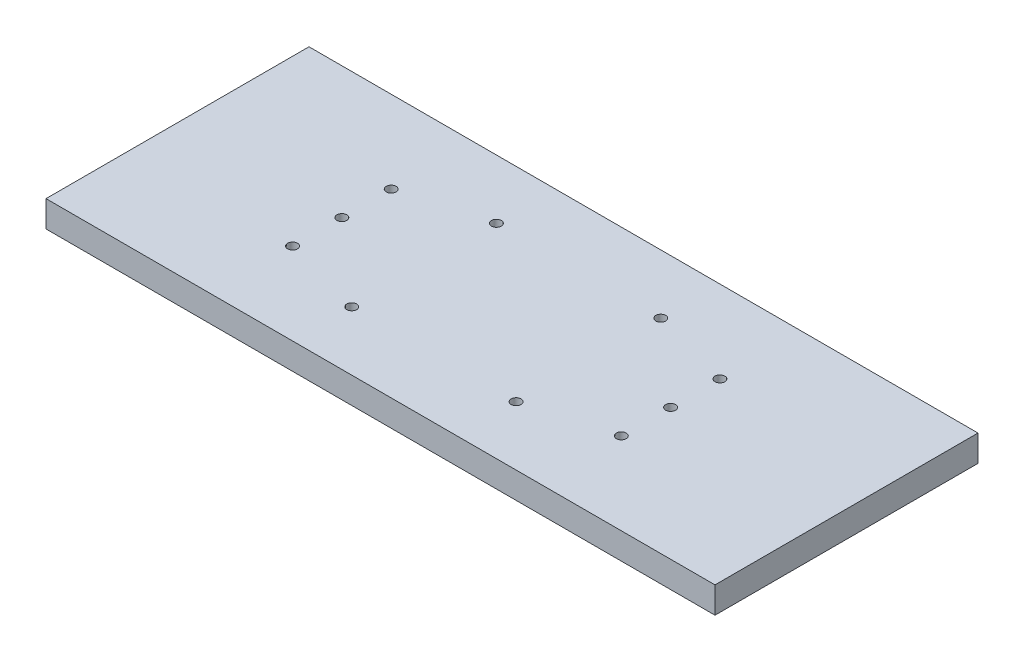
ISO-10303-21;
HEADER;
FILE_DESCRIPTION(('STEP AP214'),'2;1');
FILE_NAME('part.step','',(''),(''),'','','');
FILE_SCHEMA(('AUTOMOTIVE_DESIGN { 1 0 10303 214 1 1 1 1 }'));
ENDSEC;
DATA;
#1=APPLICATION_CONTEXT('core data for automotive mechanical design processes');
#2=APPLICATION_PROTOCOL_DEFINITION('international standard','automotive_design',2000,#1);
#3=PRODUCT_CONTEXT('',#1,'mechanical');
#4=PRODUCT('Part','Part','',(#3));
#5=PRODUCT_RELATED_PRODUCT_CATEGORY('part','',(#4));
#6=PRODUCT_DEFINITION_FORMATION('','',#4);
#7=PRODUCT_DEFINITION_CONTEXT('part definition',#1,'design');
#8=PRODUCT_DEFINITION('design','',#6,#7);
#9=PRODUCT_DEFINITION_SHAPE('','',#8);
#10=(LENGTH_UNIT() NAMED_UNIT(*) SI_UNIT(.MILLI.,.METRE.));
#11=(NAMED_UNIT(*) PLANE_ANGLE_UNIT() SI_UNIT($,.RADIAN.));
#12=(NAMED_UNIT(*) SI_UNIT($,.STERADIAN.) SOLID_ANGLE_UNIT());
#13=UNCERTAINTY_MEASURE_WITH_UNIT(LENGTH_MEASURE(1.E-05),#10,'distance_accuracy_value','');
#14=(GEOMETRIC_REPRESENTATION_CONTEXT(3) GLOBAL_UNCERTAINTY_ASSIGNED_CONTEXT((#13)) GLOBAL_UNIT_ASSIGNED_CONTEXT((#10,
#11,#12)) REPRESENTATION_CONTEXT('',''));
#15=CARTESIAN_POINT('',(0.,0.,0.));
#16=DIRECTION('',(0.,0.,1.));
#17=DIRECTION('',(1.,0.,0.));
#18=AXIS2_PLACEMENT_3D('',#15,#16,#17);
#19=CARTESIAN_POINT('',(203.5,16.,-80.));
#20=DIRECTION('',(-1.,0.,0.));
#21=DIRECTION('',(0.,0.,1.));
#22=AXIS2_PLACEMENT_3D('',#19,#20,#21);
#23=PLANE('',#22);
#24=DIRECTION('',(0.,0.,-1.));
#25=VECTOR('',#24,1.);
#26=CARTESIAN_POINT('',(203.5,0.,-80.));
#27=LINE('',#26,#25);
#28=CARTESIAN_POINT('',(203.5,0.,80.));
#29=VERTEX_POINT('',#28);
#30=CARTESIAN_POINT('',(203.5,0.,-80.));
#31=VERTEX_POINT('',#30);
#32=EDGE_CURVE('E96',#29,#31,#27,.T.);
#33=ORIENTED_EDGE('',*,*,#32,.T.);
#34=DIRECTION('',(0.,-1.,0.));
#35=VECTOR('',#34,1.);
#36=CARTESIAN_POINT('',(203.5,16.,-80.));
#37=LINE('',#36,#35);
#38=CARTESIAN_POINT('',(203.5,16.,-80.));
#39=VERTEX_POINT('',#38);
#40=EDGE_CURVE('E11',#39,#31,#37,.T.);
#41=ORIENTED_EDGE('',*,*,#40,.F.);
#42=DIRECTION('',(0.,0.,-1.));
#43=VECTOR('',#42,1.);
#44=CARTESIAN_POINT('',(203.5,16.,-80.));
#45=LINE('',#44,#43);
#46=CARTESIAN_POINT('',(203.5,16.,80.));
#47=VERTEX_POINT('',#46);
#48=EDGE_CURVE('E84',#47,#39,#45,.T.);
#49=ORIENTED_EDGE('',*,*,#48,.F.);
#50=DIRECTION('',(0.,-1.,0.));
#51=VECTOR('',#50,1.);
#52=CARTESIAN_POINT('',(203.5,16.,80.));
#53=LINE('',#52,#51);
#54=EDGE_CURVE('E92',#47,#29,#53,.T.);
#55=ORIENTED_EDGE('',*,*,#54,.T.);
#56=EDGE_LOOP('',(#33,#41,#49,#55));
#57=FACE_BOUND('',#56,.T.);
#58=ADVANCED_FACE('F33',(#57),#23,.F.);
#59=CARTESIAN_POINT('',(-203.5,16.,-80.));
#60=DIRECTION('',(0.,0.,1.));
#61=DIRECTION('',(1.,0.,0.));
#62=AXIS2_PLACEMENT_3D('',#59,#60,#61);
#63=PLANE('',#62);
#64=DIRECTION('',(-1.,0.,0.));
#65=VECTOR('',#64,1.);
#66=CARTESIAN_POINT('',(-203.5,0.,-80.));
#67=LINE('',#66,#65);
#68=CARTESIAN_POINT('',(-203.5,0.,-80.));
#69=VERTEX_POINT('',#68);
#70=EDGE_CURVE('E88',#31,#69,#67,.T.);
#71=ORIENTED_EDGE('',*,*,#70,.T.);
#72=DIRECTION('',(0.,-1.,0.));
#73=VECTOR('',#72,1.);
#74=CARTESIAN_POINT('',(-203.5,16.,-80.));
#75=LINE('',#74,#73);
#76=CARTESIAN_POINT('',(-203.5,16.,-80.));
#77=VERTEX_POINT('',#76);
#78=EDGE_CURVE('E41',#77,#69,#75,.T.);
#79=ORIENTED_EDGE('',*,*,#78,.F.);
#80=DIRECTION('',(-1.,0.,0.));
#81=VECTOR('',#80,1.);
#82=CARTESIAN_POINT('',(-203.5,16.,-80.));
#83=LINE('',#82,#81);
#84=EDGE_CURVE('E79',#39,#77,#83,.T.);
#85=ORIENTED_EDGE('',*,*,#84,.F.);
#86=ORIENTED_EDGE('',*,*,#40,.T.);
#87=EDGE_LOOP('',(#71,#79,#85,#86));
#88=FACE_BOUND('',#87,.T.);
#89=ADVANCED_FACE('F87',(#88),#63,.F.);
#90=CARTESIAN_POINT('',(-203.5,16.,-80.));
#91=DIRECTION('',(1.,0.,0.));
#92=DIRECTION('',(0.,0.,-1.));
#93=AXIS2_PLACEMENT_3D('',#90,#91,#92);
#94=PLANE('',#93);
#95=DIRECTION('',(0.,0.,1.));
#96=VECTOR('',#95,1.);
#97=CARTESIAN_POINT('',(-203.5,0.,-80.));
#98=LINE('',#97,#96);
#99=CARTESIAN_POINT('',(-203.5,0.,80.));
#100=VERTEX_POINT('',#99);
#101=EDGE_CURVE('E66',#69,#100,#98,.T.);
#102=ORIENTED_EDGE('',*,*,#101,.T.);
#103=DIRECTION('',(0.,-1.,0.));
#104=VECTOR('',#103,1.);
#105=CARTESIAN_POINT('',(-203.5,16.,80.));
#106=LINE('',#105,#104);
#107=CARTESIAN_POINT('',(-203.5,16.,80.));
#108=VERTEX_POINT('',#107);
#109=EDGE_CURVE('E89',#108,#100,#106,.T.);
#110=ORIENTED_EDGE('',*,*,#109,.F.);
#111=DIRECTION('',(0.,0.,1.));
#112=VECTOR('',#111,1.);
#113=CARTESIAN_POINT('',(-203.5,16.,-80.));
#114=LINE('',#113,#112);
#115=EDGE_CURVE('E82',#77,#108,#114,.T.);
#116=ORIENTED_EDGE('',*,*,#115,.F.);
#117=ORIENTED_EDGE('',*,*,#78,.T.);
#118=EDGE_LOOP('',(#102,#110,#116,#117));
#119=FACE_BOUND('',#118,.T.);
#120=ADVANCED_FACE('F90',(#119),#94,.F.);
#121=CARTESIAN_POINT('',(-203.5,16.,80.));
#122=DIRECTION('',(0.,0.,-1.));
#123=DIRECTION('',(-1.,0.,0.));
#124=AXIS2_PLACEMENT_3D('',#121,#122,#123);
#125=PLANE('',#124);
#126=DIRECTION('',(1.,0.,0.));
#127=VECTOR('',#126,1.);
#128=CARTESIAN_POINT('',(-203.5,0.,80.));
#129=LINE('',#128,#127);
#130=EDGE_CURVE('E72',#100,#29,#129,.T.);
#131=ORIENTED_EDGE('',*,*,#130,.T.);
#132=ORIENTED_EDGE('',*,*,#54,.F.);
#133=DIRECTION('',(1.,0.,0.));
#134=VECTOR('',#133,1.);
#135=CARTESIAN_POINT('',(-203.5,16.,80.));
#136=LINE('',#135,#134);
#137=EDGE_CURVE('E49',#108,#47,#136,.T.);
#138=ORIENTED_EDGE('',*,*,#137,.F.);
#139=ORIENTED_EDGE('',*,*,#109,.T.);
#140=EDGE_LOOP('',(#131,#132,#138,#139));
#141=FACE_BOUND('',#140,.T.);
#142=ADVANCED_FACE('F104',(#141),#125,.F.);
#143=CARTESIAN_POINT('',(0.,16.,0.));
#144=DIRECTION('',(0.,1.,0.));
#145=DIRECTION('',(0.,0.,1.));
#146=AXIS2_PLACEMENT_3D('',#143,#144,#145);
#147=PLANE('',#146);
#148=CARTESIAN_POINT('',(-103.5,16.,30.));
#149=DIRECTION('',(0.,1.,0.));
#150=DIRECTION('',(0.,0.,1.));
#151=AXIS2_PLACEMENT_3D('',#148,#149,#150);
#152=CIRCLE('',#151,3.00000000000004);
#153=CARTESIAN_POINT('',(-103.5,16.,33.));
#154=VERTEX_POINT('',#153);
#155=EDGE_CURVE('E164',#154,#154,#152,.T.);
#156=ORIENTED_EDGE('',*,*,#155,.F.);
#157=EDGE_LOOP('',(#156));
#158=FACE_BOUND('',#157,.T.);
#159=CARTESIAN_POINT('',(-103.5,16.,0.));
#160=DIRECTION('',(0.,1.,0.));
#161=DIRECTION('',(0.,0.,-1.));
#162=AXIS2_PLACEMENT_3D('',#159,#160,#161);
#163=CIRCLE('',#162,2.99999999999999);
#164=CARTESIAN_POINT('',(-103.5,16.,-2.99999999999997));
#165=VERTEX_POINT('',#164);
#166=EDGE_CURVE('E158',#165,#165,#163,.T.);
#167=ORIENTED_EDGE('',*,*,#166,.F.);
#168=EDGE_LOOP('',(#167));
#169=FACE_BOUND('',#168,.T.);
#170=CARTESIAN_POINT('',(-103.5,16.,-30.));
#171=DIRECTION('',(0.,1.,0.));
#172=DIRECTION('',(0.,0.,-1.));
#173=AXIS2_PLACEMENT_3D('',#170,#171,#172);
#174=CIRCLE('',#173,3.00000000000004);
#175=CARTESIAN_POINT('',(-103.5,16.,-33.));
#176=VERTEX_POINT('',#175);
#177=EDGE_CURVE('E152',#176,#176,#174,.T.);
#178=ORIENTED_EDGE('',*,*,#177,.F.);
#179=EDGE_LOOP('',(#178));
#180=FACE_BOUND('',#179,.T.);
#181=CARTESIAN_POINT('',(96.4999999999999,16.,30.));
#182=DIRECTION('',(0.,1.,0.));
#183=DIRECTION('',(0.,0.,-1.));
#184=AXIS2_PLACEMENT_3D('',#181,#182,#183);
#185=CIRCLE('',#184,3.00000000000001);
#186=CARTESIAN_POINT('',(96.4999999999999,16.,27.));
#187=VERTEX_POINT('',#186);
#188=EDGE_CURVE('E146',#187,#187,#185,.T.);
#189=ORIENTED_EDGE('',*,*,#188,.F.);
#190=EDGE_LOOP('',(#189));
#191=FACE_BOUND('',#190,.T.);
#192=CARTESIAN_POINT('',(96.4999999999999,16.,-30.));
#193=DIRECTION('',(0.,1.,0.));
#194=DIRECTION('',(0.,0.,1.));
#195=AXIS2_PLACEMENT_3D('',#192,#193,#194);
#196=CIRCLE('',#195,3.00000000000001);
#197=CARTESIAN_POINT('',(96.4999999999999,16.,-27.));
#198=VERTEX_POINT('',#197);
#199=EDGE_CURVE('E140',#198,#198,#196,.T.);
#200=ORIENTED_EDGE('',*,*,#199,.F.);
#201=EDGE_LOOP('',(#200));
#202=FACE_BOUND('',#201,.T.);
#203=CARTESIAN_POINT('',(96.5,16.,0.));
#204=DIRECTION('',(0.,1.,0.));
#205=DIRECTION('',(0.,0.,1.));
#206=AXIS2_PLACEMENT_3D('',#203,#204,#205);
#207=CIRCLE('',#206,3.00000000000001);
#208=CARTESIAN_POINT('',(96.5,16.,3.00000000000001));
#209=VERTEX_POINT('',#208);
#210=EDGE_CURVE('E134',#209,#209,#207,.T.);
#211=ORIENTED_EDGE('',*,*,#210,.F.);
#212=EDGE_LOOP('',(#211));
#213=FACE_BOUND('',#212,.T.);
#214=CARTESIAN_POINT('',(-53.5,16.,44.));
#215=DIRECTION('',(0.,1.,0.));
#216=DIRECTION('',(0.,0.,-1.));
#217=AXIS2_PLACEMENT_3D('',#214,#215,#216);
#218=CIRCLE('',#217,2.99999999999999);
#219=CARTESIAN_POINT('',(-53.5,16.,41.));
#220=VERTEX_POINT('',#219);
#221=EDGE_CURVE('E128',#220,#220,#218,.T.);
#222=ORIENTED_EDGE('',*,*,#221,.F.);
#223=EDGE_LOOP('',(#222));
#224=FACE_BOUND('',#223,.T.);
#225=CARTESIAN_POINT('',(46.5,16.,44.));
#226=DIRECTION('',(0.,1.,0.));
#227=DIRECTION('',(0.,0.,-1.));
#228=AXIS2_PLACEMENT_3D('',#225,#226,#227);
#229=CIRCLE('',#228,3.00000000000001);
#230=CARTESIAN_POINT('',(46.5,16.,41.));
#231=VERTEX_POINT('',#230);
#232=EDGE_CURVE('E122',#231,#231,#229,.T.);
#233=ORIENTED_EDGE('',*,*,#232,.F.);
#234=EDGE_LOOP('',(#233));
#235=FACE_BOUND('',#234,.T.);
#236=CARTESIAN_POINT('',(46.5,16.,-44.));
#237=DIRECTION('',(0.,1.,0.));
#238=DIRECTION('',(0.,0.,1.));
#239=AXIS2_PLACEMENT_3D('',#236,#237,#238);
#240=CIRCLE('',#239,3.00000000000001);
#241=CARTESIAN_POINT('',(46.5,16.,-41.));
#242=VERTEX_POINT('',#241);
#243=EDGE_CURVE('E116',#242,#242,#240,.T.);
#244=ORIENTED_EDGE('',*,*,#243,.F.);
#245=EDGE_LOOP('',(#244));
#246=FACE_BOUND('',#245,.T.);
#247=CARTESIAN_POINT('',(-53.5,16.,-44.));
#248=DIRECTION('',(0.,1.,0.));
#249=DIRECTION('',(0.,0.,1.));
#250=AXIS2_PLACEMENT_3D('',#247,#248,#249);
#251=CIRCLE('',#250,2.99999999999999);
#252=CARTESIAN_POINT('',(-53.5,16.,-41.));
#253=VERTEX_POINT('',#252);
#254=EDGE_CURVE('E110',#253,#253,#251,.T.);
#255=ORIENTED_EDGE('',*,*,#254,.F.);
#256=EDGE_LOOP('',(#255));
#257=FACE_BOUND('',#256,.T.);
#258=ORIENTED_EDGE('',*,*,#48,.T.);
#259=ORIENTED_EDGE('',*,*,#84,.T.);
#260=ORIENTED_EDGE('',*,*,#115,.T.);
#261=ORIENTED_EDGE('',*,*,#137,.T.);
#262=EDGE_LOOP('',(#258,#259,#260,#261));
#263=FACE_BOUND('',#262,.T.);
#264=ADVANCED_FACE('F80',(#158,#169,#180,#191,#202,#213,#224,#235,#246,#257,#263),#147,.T.);
#265=CARTESIAN_POINT('',(0.,0.,0.));
#266=DIRECTION('',(0.,1.,0.));
#267=DIRECTION('',(0.,0.,1.));
#268=AXIS2_PLACEMENT_3D('',#265,#266,#267);
#269=PLANE('',#268);
#270=CARTESIAN_POINT('',(-103.5,0.,30.));
#271=DIRECTION('',(0.,1.,0.));
#272=DIRECTION('',(0.,0.,1.));
#273=AXIS2_PLACEMENT_3D('',#270,#271,#272);
#274=CIRCLE('',#273,3.00000000000004);
#275=CARTESIAN_POINT('',(-103.5,0.,33.));
#276=VERTEX_POINT('',#275);
#277=EDGE_CURVE('E161',#276,#276,#274,.T.);
#278=ORIENTED_EDGE('',*,*,#277,.T.);
#279=EDGE_LOOP('',(#278));
#280=FACE_BOUND('',#279,.T.);
#281=CARTESIAN_POINT('',(-103.5,0.,0.));
#282=DIRECTION('',(0.,1.,0.));
#283=DIRECTION('',(0.,0.,-1.));
#284=AXIS2_PLACEMENT_3D('',#281,#282,#283);
#285=CIRCLE('',#284,2.99999999999999);
#286=CARTESIAN_POINT('',(-103.5,0.,-2.99999999999997));
#287=VERTEX_POINT('',#286);
#288=EDGE_CURVE('E155',#287,#287,#285,.T.);
#289=ORIENTED_EDGE('',*,*,#288,.T.);
#290=EDGE_LOOP('',(#289));
#291=FACE_BOUND('',#290,.T.);
#292=CARTESIAN_POINT('',(-103.5,0.,-30.));
#293=DIRECTION('',(0.,1.,0.));
#294=DIRECTION('',(0.,0.,-1.));
#295=AXIS2_PLACEMENT_3D('',#292,#293,#294);
#296=CIRCLE('',#295,3.00000000000004);
#297=CARTESIAN_POINT('',(-103.5,0.,-33.));
#298=VERTEX_POINT('',#297);
#299=EDGE_CURVE('E149',#298,#298,#296,.T.);
#300=ORIENTED_EDGE('',*,*,#299,.T.);
#301=EDGE_LOOP('',(#300));
#302=FACE_BOUND('',#301,.T.);
#303=CARTESIAN_POINT('',(96.4999999999999,0.,30.));
#304=DIRECTION('',(0.,1.,0.));
#305=DIRECTION('',(0.,0.,-1.));
#306=AXIS2_PLACEMENT_3D('',#303,#304,#305);
#307=CIRCLE('',#306,3.00000000000001);
#308=CARTESIAN_POINT('',(96.4999999999999,0.,27.));
#309=VERTEX_POINT('',#308);
#310=EDGE_CURVE('E143',#309,#309,#307,.T.);
#311=ORIENTED_EDGE('',*,*,#310,.T.);
#312=EDGE_LOOP('',(#311));
#313=FACE_BOUND('',#312,.T.);
#314=CARTESIAN_POINT('',(96.4999999999999,0.,-30.));
#315=DIRECTION('',(0.,1.,0.));
#316=DIRECTION('',(0.,0.,1.));
#317=AXIS2_PLACEMENT_3D('',#314,#315,#316);
#318=CIRCLE('',#317,3.00000000000001);
#319=CARTESIAN_POINT('',(96.4999999999999,0.,-27.));
#320=VERTEX_POINT('',#319);
#321=EDGE_CURVE('E137',#320,#320,#318,.T.);
#322=ORIENTED_EDGE('',*,*,#321,.T.);
#323=EDGE_LOOP('',(#322));
#324=FACE_BOUND('',#323,.T.);
#325=CARTESIAN_POINT('',(96.5,0.,0.));
#326=DIRECTION('',(0.,1.,0.));
#327=DIRECTION('',(0.,0.,1.));
#328=AXIS2_PLACEMENT_3D('',#325,#326,#327);
#329=CIRCLE('',#328,3.00000000000001);
#330=CARTESIAN_POINT('',(96.5,0.,3.00000000000001));
#331=VERTEX_POINT('',#330);
#332=EDGE_CURVE('E131',#331,#331,#329,.T.);
#333=ORIENTED_EDGE('',*,*,#332,.T.);
#334=EDGE_LOOP('',(#333));
#335=FACE_BOUND('',#334,.T.);
#336=CARTESIAN_POINT('',(-53.5,0.,44.));
#337=DIRECTION('',(0.,1.,0.));
#338=DIRECTION('',(0.,0.,-1.));
#339=AXIS2_PLACEMENT_3D('',#336,#337,#338);
#340=CIRCLE('',#339,2.99999999999999);
#341=CARTESIAN_POINT('',(-53.5,0.,41.));
#342=VERTEX_POINT('',#341);
#343=EDGE_CURVE('E125',#342,#342,#340,.T.);
#344=ORIENTED_EDGE('',*,*,#343,.T.);
#345=EDGE_LOOP('',(#344));
#346=FACE_BOUND('',#345,.T.);
#347=CARTESIAN_POINT('',(46.5,0.,44.));
#348=DIRECTION('',(0.,1.,0.));
#349=DIRECTION('',(0.,0.,-1.));
#350=AXIS2_PLACEMENT_3D('',#347,#348,#349);
#351=CIRCLE('',#350,3.00000000000001);
#352=CARTESIAN_POINT('',(46.5,0.,41.));
#353=VERTEX_POINT('',#352);
#354=EDGE_CURVE('E119',#353,#353,#351,.T.);
#355=ORIENTED_EDGE('',*,*,#354,.T.);
#356=EDGE_LOOP('',(#355));
#357=FACE_BOUND('',#356,.T.);
#358=CARTESIAN_POINT('',(46.5,0.,-44.));
#359=DIRECTION('',(0.,1.,0.));
#360=DIRECTION('',(0.,0.,1.));
#361=AXIS2_PLACEMENT_3D('',#358,#359,#360);
#362=CIRCLE('',#361,3.00000000000001);
#363=CARTESIAN_POINT('',(46.5,0.,-41.));
#364=VERTEX_POINT('',#363);
#365=EDGE_CURVE('E113',#364,#364,#362,.T.);
#366=ORIENTED_EDGE('',*,*,#365,.T.);
#367=EDGE_LOOP('',(#366));
#368=FACE_BOUND('',#367,.T.);
#369=CARTESIAN_POINT('',(-53.5,0.,-44.));
#370=DIRECTION('',(0.,1.,0.));
#371=DIRECTION('',(0.,0.,1.));
#372=AXIS2_PLACEMENT_3D('',#369,#370,#371);
#373=CIRCLE('',#372,2.99999999999999);
#374=CARTESIAN_POINT('',(-53.5,0.,-41.));
#375=VERTEX_POINT('',#374);
#376=EDGE_CURVE('E99',#375,#375,#373,.T.);
#377=ORIENTED_EDGE('',*,*,#376,.T.);
#378=EDGE_LOOP('',(#377));
#379=FACE_BOUND('',#378,.T.);
#380=ORIENTED_EDGE('',*,*,#32,.F.);
#381=ORIENTED_EDGE('',*,*,#130,.F.);
#382=ORIENTED_EDGE('',*,*,#101,.F.);
#383=ORIENTED_EDGE('',*,*,#70,.F.);
#384=EDGE_LOOP('',(#380,#381,#382,#383));
#385=FACE_BOUND('',#384,.T.);
#386=ADVANCED_FACE('F107',(#280,#291,#302,#313,#324,#335,#346,#357,#368,#379,#385),#269,.F.);
#387=CARTESIAN_POINT('',(-53.5,0.,-44.));
#388=DIRECTION('',(0.,1.,0.));
#389=DIRECTION('',(0.,0.,1.));
#390=AXIS2_PLACEMENT_3D('',#387,#388,#389);
#391=CYLINDRICAL_SURFACE('',#390,2.99999999999999);
#392=ORIENTED_EDGE('',*,*,#376,.F.);
#393=EDGE_LOOP('',(#392));
#394=FACE_BOUND('',#393,.T.);
#395=ORIENTED_EDGE('',*,*,#254,.T.);
#396=EDGE_LOOP('',(#395));
#397=FACE_BOUND('',#396,.T.);
#398=ADVANCED_FACE('F200',(#394,#397),#391,.F.);
#399=CARTESIAN_POINT('',(46.5,0.,-44.));
#400=DIRECTION('',(0.,1.,0.));
#401=DIRECTION('',(0.,0.,1.));
#402=AXIS2_PLACEMENT_3D('',#399,#400,#401);
#403=CYLINDRICAL_SURFACE('',#402,3.00000000000001);
#404=ORIENTED_EDGE('',*,*,#365,.F.);
#405=EDGE_LOOP('',(#404));
#406=FACE_BOUND('',#405,.T.);
#407=ORIENTED_EDGE('',*,*,#243,.T.);
#408=EDGE_LOOP('',(#407));
#409=FACE_BOUND('',#408,.T.);
#410=ADVANCED_FACE('F202',(#406,#409),#403,.F.);
#411=CARTESIAN_POINT('',(46.5,0.,44.));
#412=DIRECTION('',(0.,1.,0.));
#413=DIRECTION('',(0.,0.,1.));
#414=AXIS2_PLACEMENT_3D('',#411,#412,#413);
#415=CYLINDRICAL_SURFACE('',#414,3.00000000000001);
#416=ORIENTED_EDGE('',*,*,#354,.F.);
#417=EDGE_LOOP('',(#416));
#418=FACE_BOUND('',#417,.T.);
#419=ORIENTED_EDGE('',*,*,#232,.T.);
#420=EDGE_LOOP('',(#419));
#421=FACE_BOUND('',#420,.T.);
#422=ADVANCED_FACE('F209',(#418,#421),#415,.F.);
#423=CARTESIAN_POINT('',(-53.5,0.,44.));
#424=DIRECTION('',(0.,1.,0.));
#425=DIRECTION('',(0.,0.,1.));
#426=AXIS2_PLACEMENT_3D('',#423,#424,#425);
#427=CYLINDRICAL_SURFACE('',#426,2.99999999999999);
#428=ORIENTED_EDGE('',*,*,#343,.F.);
#429=EDGE_LOOP('',(#428));
#430=FACE_BOUND('',#429,.T.);
#431=ORIENTED_EDGE('',*,*,#221,.T.);
#432=EDGE_LOOP('',(#431));
#433=FACE_BOUND('',#432,.T.);
#434=ADVANCED_FACE('F255',(#430,#433),#427,.F.);
#435=CARTESIAN_POINT('',(96.5,0.,0.));
#436=DIRECTION('',(0.,1.,0.));
#437=DIRECTION('',(0.,0.,1.));
#438=AXIS2_PLACEMENT_3D('',#435,#436,#437);
#439=CYLINDRICAL_SURFACE('',#438,3.00000000000001);
#440=ORIENTED_EDGE('',*,*,#332,.F.);
#441=EDGE_LOOP('',(#440));
#442=FACE_BOUND('',#441,.T.);
#443=ORIENTED_EDGE('',*,*,#210,.T.);
#444=EDGE_LOOP('',(#443));
#445=FACE_BOUND('',#444,.T.);
#446=ADVANCED_FACE('F265',(#442,#445),#439,.F.);
#447=CARTESIAN_POINT('',(96.4999999999999,0.,-30.));
#448=DIRECTION('',(0.,1.,0.));
#449=DIRECTION('',(0.,0.,1.));
#450=AXIS2_PLACEMENT_3D('',#447,#448,#449);
#451=CYLINDRICAL_SURFACE('',#450,3.00000000000001);
#452=ORIENTED_EDGE('',*,*,#321,.F.);
#453=EDGE_LOOP('',(#452));
#454=FACE_BOUND('',#453,.T.);
#455=ORIENTED_EDGE('',*,*,#199,.T.);
#456=EDGE_LOOP('',(#455));
#457=FACE_BOUND('',#456,.T.);
#458=ADVANCED_FACE('F275',(#454,#457),#451,.F.);
#459=CARTESIAN_POINT('',(96.4999999999999,0.,30.));
#460=DIRECTION('',(0.,1.,0.));
#461=DIRECTION('',(0.,0.,1.));
#462=AXIS2_PLACEMENT_3D('',#459,#460,#461);
#463=CYLINDRICAL_SURFACE('',#462,3.00000000000001);
#464=ORIENTED_EDGE('',*,*,#310,.F.);
#465=EDGE_LOOP('',(#464));
#466=FACE_BOUND('',#465,.T.);
#467=ORIENTED_EDGE('',*,*,#188,.T.);
#468=EDGE_LOOP('',(#467));
#469=FACE_BOUND('',#468,.T.);
#470=ADVANCED_FACE('F285',(#466,#469),#463,.F.);
#471=CARTESIAN_POINT('',(-103.5,0.,-30.));
#472=DIRECTION('',(0.,1.,0.));
#473=DIRECTION('',(0.,0.,1.));
#474=AXIS2_PLACEMENT_3D('',#471,#472,#473);
#475=CYLINDRICAL_SURFACE('',#474,3.00000000000004);
#476=ORIENTED_EDGE('',*,*,#299,.F.);
#477=EDGE_LOOP('',(#476));
#478=FACE_BOUND('',#477,.T.);
#479=ORIENTED_EDGE('',*,*,#177,.T.);
#480=EDGE_LOOP('',(#479));
#481=FACE_BOUND('',#480,.T.);
#482=ADVANCED_FACE('F295',(#478,#481),#475,.F.);
#483=CARTESIAN_POINT('',(-103.5,0.,0.));
#484=DIRECTION('',(0.,1.,0.));
#485=DIRECTION('',(0.,0.,1.));
#486=AXIS2_PLACEMENT_3D('',#483,#484,#485);
#487=CYLINDRICAL_SURFACE('',#486,2.99999999999999);
#488=ORIENTED_EDGE('',*,*,#288,.F.);
#489=EDGE_LOOP('',(#488));
#490=FACE_BOUND('',#489,.T.);
#491=ORIENTED_EDGE('',*,*,#166,.T.);
#492=EDGE_LOOP('',(#491));
#493=FACE_BOUND('',#492,.T.);
#494=ADVANCED_FACE('F175',(#490,#493),#487,.F.);
#495=CARTESIAN_POINT('',(-103.5,0.,30.));
#496=DIRECTION('',(0.,1.,0.));
#497=DIRECTION('',(0.,0.,1.));
#498=AXIS2_PLACEMENT_3D('',#495,#496,#497);
#499=CYLINDRICAL_SURFACE('',#498,3.00000000000004);
#500=ORIENTED_EDGE('',*,*,#277,.F.);
#501=EDGE_LOOP('',(#500));
#502=FACE_BOUND('',#501,.T.);
#503=ORIENTED_EDGE('',*,*,#155,.T.);
#504=EDGE_LOOP('',(#503));
#505=FACE_BOUND('',#504,.T.);
#506=ADVANCED_FACE('F172',(#502,#505),#499,.F.);
#507=CLOSED_SHELL('',(#58,#89,#120,#142,#264,#386,#398,#410,#422,#434,#446,#458,#470,#482,#494,#506));
#508=MANIFOLD_SOLID_BREP('B2',#507);
#509=ADVANCED_BREP_SHAPE_REPRESENTATION('',(#18,#508),#14);
#510=SHAPE_DEFINITION_REPRESENTATION(#9,#509);
ENDSEC;
END-ISO-10303-21;
